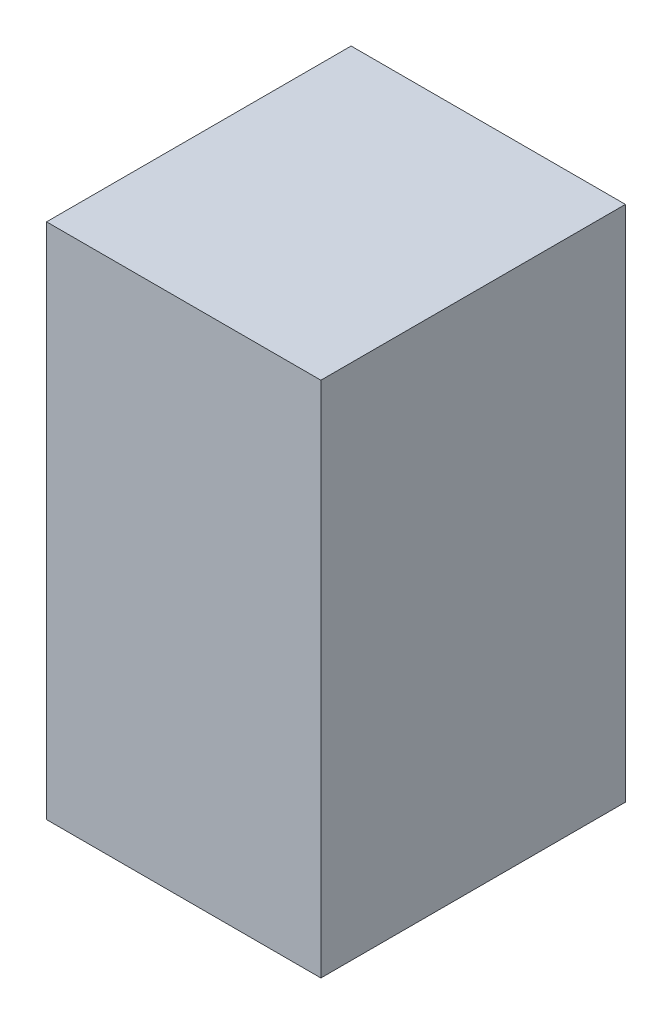
ISO-10303-21;
HEADER;
FILE_DESCRIPTION(('STEP AP214'),'2;1');
FILE_NAME('part.step','',(''),(''),'','','');
FILE_SCHEMA(('AUTOMOTIVE_DESIGN { 1 0 10303 214 1 1 1 1 }'));
ENDSEC;
DATA;
#1=APPLICATION_CONTEXT('core data for automotive mechanical design processes');
#2=APPLICATION_PROTOCOL_DEFINITION('international standard','automotive_design',2000,#1);
#3=PRODUCT_CONTEXT('',#1,'mechanical');
#4=PRODUCT('Part','Part','',(#3));
#5=PRODUCT_RELATED_PRODUCT_CATEGORY('part','',(#4));
#6=PRODUCT_DEFINITION_FORMATION('','',#4);
#7=PRODUCT_DEFINITION_CONTEXT('part definition',#1,'design');
#8=PRODUCT_DEFINITION('design','',#6,#7);
#9=PRODUCT_DEFINITION_SHAPE('','',#8);
#10=(LENGTH_UNIT() NAMED_UNIT(*) SI_UNIT(.MILLI.,.METRE.));
#11=(NAMED_UNIT(*) PLANE_ANGLE_UNIT() SI_UNIT($,.RADIAN.));
#12=(NAMED_UNIT(*) SI_UNIT($,.STERADIAN.) SOLID_ANGLE_UNIT());
#13=UNCERTAINTY_MEASURE_WITH_UNIT(LENGTH_MEASURE(1.E-05),#10,'distance_accuracy_value','');
#14=(GEOMETRIC_REPRESENTATION_CONTEXT(3) GLOBAL_UNCERTAINTY_ASSIGNED_CONTEXT((#13)) GLOBAL_UNIT_ASSIGNED_CONTEXT((#10,
#11,#12)) REPRESENTATION_CONTEXT('',''));
#15=CARTESIAN_POINT('',(0.,0.,0.));
#16=DIRECTION('',(0.,0.,1.));
#17=DIRECTION('',(1.,0.,0.));
#18=AXIS2_PLACEMENT_3D('',#15,#16,#17);
#19=CARTESIAN_POINT('',(-0.4508,-0.85,1.));
#20=DIRECTION('',(1.,0.,0.));
#21=DIRECTION('',(0.,0.,-1.));
#22=AXIS2_PLACEMENT_3D('',#19,#20,#21);
#23=PLANE('',#22);
#24=DIRECTION('',(0.,-1.,0.));
#25=VECTOR('',#24,1.);
#26=CARTESIAN_POINT('',(-0.4508,-0.85,0.));
#27=LINE('',#26,#25);
#28=CARTESIAN_POINT('',(-0.4508,0.85,0.));
#29=VERTEX_POINT('',#28);
#30=CARTESIAN_POINT('',(-0.4508,-0.85,0.));
#31=VERTEX_POINT('',#30);
#32=EDGE_CURVE('E96',#29,#31,#27,.T.);
#33=ORIENTED_EDGE('',*,*,#32,.T.);
#34=DIRECTION('',(0.,0.,-1.));
#35=VECTOR('',#34,1.);
#36=CARTESIAN_POINT('',(-0.4508,-0.85,1.));
#37=LINE('',#36,#35);
#38=CARTESIAN_POINT('',(-0.4508,-0.85,1.));
#39=VERTEX_POINT('',#38);
#40=EDGE_CURVE('E11',#39,#31,#37,.T.);
#41=ORIENTED_EDGE('',*,*,#40,.F.);
#42=DIRECTION('',(0.,-1.,0.));
#43=VECTOR('',#42,1.);
#44=CARTESIAN_POINT('',(-0.4508,-0.85,1.));
#45=LINE('',#44,#43);
#46=CARTESIAN_POINT('',(-0.4508,0.85,1.));
#47=VERTEX_POINT('',#46);
#48=EDGE_CURVE('E84',#47,#39,#45,.T.);
#49=ORIENTED_EDGE('',*,*,#48,.F.);
#50=DIRECTION('',(0.,0.,-1.));
#51=VECTOR('',#50,1.);
#52=CARTESIAN_POINT('',(-0.4508,0.85,1.));
#53=LINE('',#52,#51);
#54=EDGE_CURVE('E92',#47,#29,#53,.T.);
#55=ORIENTED_EDGE('',*,*,#54,.T.);
#56=EDGE_LOOP('',(#33,#41,#49,#55));
#57=FACE_BOUND('',#56,.T.);
#58=ADVANCED_FACE('F33',(#57),#23,.F.);
#59=CARTESIAN_POINT('',(0.45,-0.85,1.));
#60=DIRECTION('',(0.,1.,0.));
#61=DIRECTION('',(0.,0.,1.));
#62=AXIS2_PLACEMENT_3D('',#59,#60,#61);
#63=PLANE('',#62);
#64=DIRECTION('',(1.,0.,0.));
#65=VECTOR('',#64,1.);
#66=CARTESIAN_POINT('',(0.45,-0.85,0.));
#67=LINE('',#66,#65);
#68=CARTESIAN_POINT('',(0.45,-0.85,0.));
#69=VERTEX_POINT('',#68);
#70=EDGE_CURVE('E88',#31,#69,#67,.T.);
#71=ORIENTED_EDGE('',*,*,#70,.T.);
#72=DIRECTION('',(0.,0.,-1.));
#73=VECTOR('',#72,1.);
#74=CARTESIAN_POINT('',(0.45,-0.85,1.));
#75=LINE('',#74,#73);
#76=CARTESIAN_POINT('',(0.45,-0.85,1.));
#77=VERTEX_POINT('',#76);
#78=EDGE_CURVE('E41',#77,#69,#75,.T.);
#79=ORIENTED_EDGE('',*,*,#78,.F.);
#80=DIRECTION('',(1.,0.,0.));
#81=VECTOR('',#80,1.);
#82=CARTESIAN_POINT('',(0.45,-0.85,1.));
#83=LINE('',#82,#81);
#84=EDGE_CURVE('E79',#39,#77,#83,.T.);
#85=ORIENTED_EDGE('',*,*,#84,.F.);
#86=ORIENTED_EDGE('',*,*,#40,.T.);
#87=EDGE_LOOP('',(#71,#79,#85,#86));
#88=FACE_BOUND('',#87,.T.);
#89=ADVANCED_FACE('F87',(#88),#63,.F.);
#90=CARTESIAN_POINT('',(0.45,0.85,1.));
#91=DIRECTION('',(-1.,0.,0.));
#92=DIRECTION('',(0.,0.,1.));
#93=AXIS2_PLACEMENT_3D('',#90,#91,#92);
#94=PLANE('',#93);
#95=DIRECTION('',(0.,1.,0.));
#96=VECTOR('',#95,1.);
#97=CARTESIAN_POINT('',(0.45,0.85,0.));
#98=LINE('',#97,#96);
#99=CARTESIAN_POINT('',(0.45,0.85,0.));
#100=VERTEX_POINT('',#99);
#101=EDGE_CURVE('E66',#69,#100,#98,.T.);
#102=ORIENTED_EDGE('',*,*,#101,.T.);
#103=DIRECTION('',(0.,0.,-1.));
#104=VECTOR('',#103,1.);
#105=CARTESIAN_POINT('',(0.45,0.85,1.));
#106=LINE('',#105,#104);
#107=CARTESIAN_POINT('',(0.45,0.85,1.));
#108=VERTEX_POINT('',#107);
#109=EDGE_CURVE('E89',#108,#100,#106,.T.);
#110=ORIENTED_EDGE('',*,*,#109,.F.);
#111=DIRECTION('',(0.,1.,0.));
#112=VECTOR('',#111,1.);
#113=CARTESIAN_POINT('',(0.45,0.85,1.));
#114=LINE('',#113,#112);
#115=EDGE_CURVE('E82',#77,#108,#114,.T.);
#116=ORIENTED_EDGE('',*,*,#115,.F.);
#117=ORIENTED_EDGE('',*,*,#78,.T.);
#118=EDGE_LOOP('',(#102,#110,#116,#117));
#119=FACE_BOUND('',#118,.T.);
#120=ADVANCED_FACE('F90',(#119),#94,.F.);
#121=CARTESIAN_POINT('',(-0.4508,0.85,1.));
#122=DIRECTION('',(0.,-1.,0.));
#123=DIRECTION('',(0.,0.,-1.));
#124=AXIS2_PLACEMENT_3D('',#121,#122,#123);
#125=PLANE('',#124);
#126=DIRECTION('',(-1.,0.,0.));
#127=VECTOR('',#126,1.);
#128=CARTESIAN_POINT('',(-0.4508,0.85,0.));
#129=LINE('',#128,#127);
#130=EDGE_CURVE('E72',#100,#29,#129,.T.);
#131=ORIENTED_EDGE('',*,*,#130,.T.);
#132=ORIENTED_EDGE('',*,*,#54,.F.);
#133=DIRECTION('',(-1.,0.,0.));
#134=VECTOR('',#133,1.);
#135=CARTESIAN_POINT('',(-0.4508,0.85,1.));
#136=LINE('',#135,#134);
#137=EDGE_CURVE('E49',#108,#47,#136,.T.);
#138=ORIENTED_EDGE('',*,*,#137,.F.);
#139=ORIENTED_EDGE('',*,*,#109,.T.);
#140=EDGE_LOOP('',(#131,#132,#138,#139));
#141=FACE_BOUND('',#140,.T.);
#142=ADVANCED_FACE('F103',(#141),#125,.F.);
#143=CARTESIAN_POINT('',(0.,0.,1.));
#144=DIRECTION('',(0.,0.,-1.));
#145=DIRECTION('',(-1.,0.,0.));
#146=AXIS2_PLACEMENT_3D('',#143,#144,#145);
#147=PLANE('',#146);
#148=ORIENTED_EDGE('',*,*,#48,.T.);
#149=ORIENTED_EDGE('',*,*,#84,.T.);
#150=ORIENTED_EDGE('',*,*,#115,.T.);
#151=ORIENTED_EDGE('',*,*,#137,.T.);
#152=EDGE_LOOP('',(#148,#149,#150,#151));
#153=FACE_BOUND('',#152,.T.);
#154=ADVANCED_FACE('F80',(#153),#147,.F.);
#155=CARTESIAN_POINT('',(0.,0.,0.));
#156=DIRECTION('',(0.,0.,-1.));
#157=DIRECTION('',(-1.,0.,0.));
#158=AXIS2_PLACEMENT_3D('',#155,#156,#157);
#159=PLANE('',#158);
#160=ORIENTED_EDGE('',*,*,#32,.F.);
#161=ORIENTED_EDGE('',*,*,#130,.F.);
#162=ORIENTED_EDGE('',*,*,#101,.F.);
#163=ORIENTED_EDGE('',*,*,#70,.F.);
#164=EDGE_LOOP('',(#160,#161,#162,#163));
#165=FACE_BOUND('',#164,.T.);
#166=ADVANCED_FACE('F106',(#165),#159,.T.);
#167=CLOSED_SHELL('',(#58,#89,#120,#142,#154,#166));
#168=MANIFOLD_SOLID_BREP('B2',#167);
#169=ADVANCED_BREP_SHAPE_REPRESENTATION('',(#18,#168),#14);
#170=SHAPE_DEFINITION_REPRESENTATION(#9,#169);
ENDSEC;
END-ISO-10303-21;
